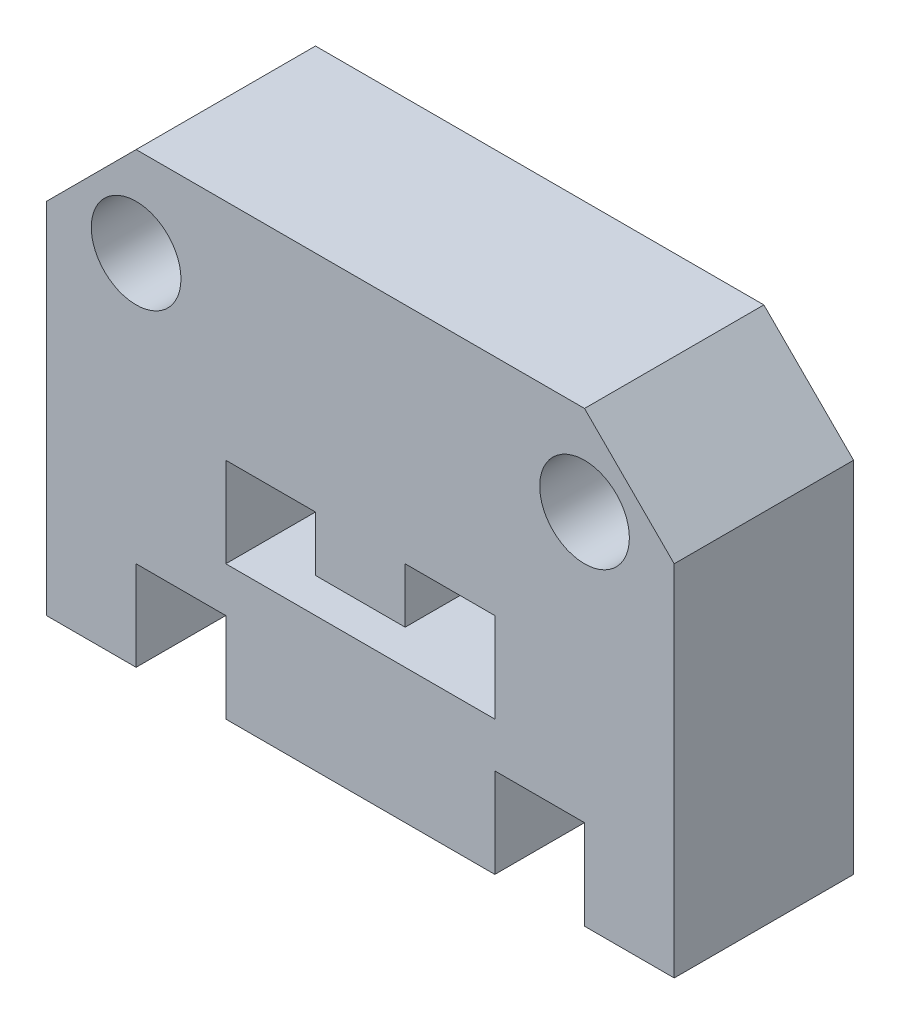
ISO-10303-21;
HEADER;
FILE_DESCRIPTION(('STEP AP214'),'2;1');
FILE_NAME('part.step','',(''),(''),'','','');
FILE_SCHEMA(('AUTOMOTIVE_DESIGN { 1 0 10303 214 1 1 1 1 }'));
ENDSEC;
DATA;
#1=APPLICATION_CONTEXT('core data for automotive mechanical design processes');
#2=APPLICATION_PROTOCOL_DEFINITION('international standard','automotive_design',2000,#1);
#3=PRODUCT_CONTEXT('',#1,'mechanical');
#4=PRODUCT('Part','Part','',(#3));
#5=PRODUCT_RELATED_PRODUCT_CATEGORY('part','',(#4));
#6=PRODUCT_DEFINITION_FORMATION('','',#4);
#7=PRODUCT_DEFINITION_CONTEXT('part definition',#1,'design');
#8=PRODUCT_DEFINITION('design','',#6,#7);
#9=PRODUCT_DEFINITION_SHAPE('','',#8);
#10=(LENGTH_UNIT() NAMED_UNIT(*) SI_UNIT(.MILLI.,.METRE.));
#11=(NAMED_UNIT(*) PLANE_ANGLE_UNIT() SI_UNIT($,.RADIAN.));
#12=(NAMED_UNIT(*) SI_UNIT($,.STERADIAN.) SOLID_ANGLE_UNIT());
#13=UNCERTAINTY_MEASURE_WITH_UNIT(LENGTH_MEASURE(1.E-05),#10,'distance_accuracy_value','');
#14=(GEOMETRIC_REPRESENTATION_CONTEXT(3) GLOBAL_UNCERTAINTY_ASSIGNED_CONTEXT((#13)) GLOBAL_UNIT_ASSIGNED_CONTEXT((#10,
#11,#12)) REPRESENTATION_CONTEXT('',''));
#15=CARTESIAN_POINT('',(0.,0.,0.));
#16=DIRECTION('',(0.,0.,1.));
#17=DIRECTION('',(1.,0.,0.));
#18=AXIS2_PLACEMENT_3D('',#15,#16,#17);
#19=CARTESIAN_POINT('',(0.,0.,20.));
#20=DIRECTION('',(0.,0.,1.));
#21=DIRECTION('',(1.,0.,0.));
#22=AXIS2_PLACEMENT_3D('',#19,#20,#21);
#23=PLANE('',#22);
#24=CARTESIAN_POINT('',(-25.,21.1256147843034,20.));
#25=DIRECTION('',(0.,0.,1.));
#26=DIRECTION('',(1.,0.,0.));
#27=AXIS2_PLACEMENT_3D('',#24,#25,#26);
#28=CIRCLE('',#27,5.);
#29=CARTESIAN_POINT('',(-20.,21.1256147843034,20.));
#30=VERTEX_POINT('',#29);
#31=EDGE_CURVE('E241',#30,#30,#28,.T.);
#32=ORIENTED_EDGE('',*,*,#31,.F.);
#33=EDGE_LOOP('',(#32));
#34=FACE_BOUND('',#33,.T.);
#35=DIRECTION('',(1.,0.,0.));
#36=VECTOR('',#35,1.);
#37=CARTESIAN_POINT('',(-15.,-8.87438521569662,20.));
#38=LINE('',#37,#36);
#39=CARTESIAN_POINT('',(-25.,-8.87438521569663,20.));
#40=VERTEX_POINT('',#39);
#41=CARTESIAN_POINT('',(-15.,-8.87438521569662,20.));
#42=VERTEX_POINT('',#41);
#43=EDGE_CURVE('E285',#40,#42,#38,.T.);
#44=ORIENTED_EDGE('',*,*,#43,.T.);
#45=DIRECTION('',(0.,-1.,0.));
#46=VECTOR('',#45,1.);
#47=CARTESIAN_POINT('',(-15.,-18.8743852156966,20.));
#48=LINE('',#47,#46);
#49=CARTESIAN_POINT('',(-15.,-18.8743852156966,20.));
#50=VERTEX_POINT('',#49);
#51=EDGE_CURVE('E289',#42,#50,#48,.T.);
#52=ORIENTED_EDGE('',*,*,#51,.T.);
#53=DIRECTION('',(1.,0.,0.));
#54=VECTOR('',#53,1.);
#55=CARTESIAN_POINT('',(-15.,-18.8743852156966,20.));
#56=LINE('',#55,#54);
#57=CARTESIAN_POINT('',(15.,-18.8743852156966,20.));
#58=VERTEX_POINT('',#57);
#59=EDGE_CURVE('E293',#50,#58,#56,.T.);
#60=ORIENTED_EDGE('',*,*,#59,.T.);
#61=DIRECTION('',(0.,1.,0.));
#62=VECTOR('',#61,1.);
#63=CARTESIAN_POINT('',(15.,-18.8743852156966,20.));
#64=LINE('',#63,#62);
#65=CARTESIAN_POINT('',(15.,-8.87438521569662,20.));
#66=VERTEX_POINT('',#65);
#67=EDGE_CURVE('E296',#58,#66,#64,.T.);
#68=ORIENTED_EDGE('',*,*,#67,.T.);
#69=DIRECTION('',(1.,0.,0.));
#70=VECTOR('',#69,1.);
#71=CARTESIAN_POINT('',(15.,-8.87438521569662,20.));
#72=LINE('',#71,#70);
#73=CARTESIAN_POINT('',(25.,-8.87438521569662,20.));
#74=VERTEX_POINT('',#73);
#75=EDGE_CURVE('E299',#66,#74,#72,.T.);
#76=ORIENTED_EDGE('',*,*,#75,.T.);
#77=DIRECTION('',(0.,-1.,0.));
#78=VECTOR('',#77,1.);
#79=CARTESIAN_POINT('',(25.,-8.87438521569662,20.));
#80=LINE('',#79,#78);
#81=CARTESIAN_POINT('',(25.,-18.8743852156966,20.));
#82=VERTEX_POINT('',#81);
#83=EDGE_CURVE('E302',#74,#82,#80,.T.);
#84=ORIENTED_EDGE('',*,*,#83,.T.);
#85=DIRECTION('',(1.,0.,0.));
#86=VECTOR('',#85,1.);
#87=CARTESIAN_POINT('',(25.,-18.8743852156966,20.));
#88=LINE('',#87,#86);
#89=CARTESIAN_POINT('',(35.,-18.8743852156966,20.));
#90=VERTEX_POINT('',#89);
#91=EDGE_CURVE('E305',#82,#90,#88,.T.);
#92=ORIENTED_EDGE('',*,*,#91,.T.);
#93=DIRECTION('',(0.,1.,0.));
#94=VECTOR('',#93,1.);
#95=CARTESIAN_POINT('',(35.,-18.8743852156966,20.));
#96=LINE('',#95,#94);
#97=CARTESIAN_POINT('',(35.,21.1256147843034,20.));
#98=VERTEX_POINT('',#97);
#99=EDGE_CURVE('E308',#90,#98,#96,.T.);
#100=ORIENTED_EDGE('',*,*,#99,.T.);
#101=DIRECTION('',(-0.707106781186546,0.707106781186549,0.));
#102=VECTOR('',#101,1.);
#103=CARTESIAN_POINT('',(35.,21.1256147843034,20.));
#104=LINE('',#103,#102);
#105=CARTESIAN_POINT('',(25.,31.1256147843034,20.));
#106=VERTEX_POINT('',#105);
#107=EDGE_CURVE('E311',#98,#106,#104,.T.);
#108=ORIENTED_EDGE('',*,*,#107,.T.);
#109=DIRECTION('',(-1.,0.,0.));
#110=VECTOR('',#109,1.);
#111=CARTESIAN_POINT('',(-25.,31.1256147843034,20.));
#112=LINE('',#111,#110);
#113=CARTESIAN_POINT('',(-25.,31.1256147843034,20.));
#114=VERTEX_POINT('',#113);
#115=EDGE_CURVE('E314',#106,#114,#112,.T.);
#116=ORIENTED_EDGE('',*,*,#115,.T.);
#117=DIRECTION('',(-0.707106781186547,-0.707106781186548,0.));
#118=VECTOR('',#117,1.);
#119=CARTESIAN_POINT('',(-35.,21.1256147843034,20.));
#120=LINE('',#119,#118);
#121=CARTESIAN_POINT('',(-35.,21.1256147843034,20.));
#122=VERTEX_POINT('',#121);
#123=EDGE_CURVE('E317',#114,#122,#120,.T.);
#124=ORIENTED_EDGE('',*,*,#123,.T.);
#125=DIRECTION('',(0.,-1.,0.));
#126=VECTOR('',#125,1.);
#127=CARTESIAN_POINT('',(-35.,-18.8743852156966,20.));
#128=LINE('',#127,#126);
#129=CARTESIAN_POINT('',(-35.,-18.8743852156966,20.));
#130=VERTEX_POINT('',#129);
#131=EDGE_CURVE('E320',#122,#130,#128,.T.);
#132=ORIENTED_EDGE('',*,*,#131,.T.);
#133=DIRECTION('',(1.,0.,0.));
#134=VECTOR('',#133,1.);
#135=CARTESIAN_POINT('',(-25.,-18.8743852156966,20.));
#136=LINE('',#135,#134);
#137=CARTESIAN_POINT('',(-25.,-18.8743852156966,20.));
#138=VERTEX_POINT('',#137);
#139=EDGE_CURVE('E323',#130,#138,#136,.T.);
#140=ORIENTED_EDGE('',*,*,#139,.T.);
#141=DIRECTION('',(0.,1.,0.));
#142=VECTOR('',#141,1.);
#143=CARTESIAN_POINT('',(-25.,-8.87438521569663,20.));
#144=LINE('',#143,#142);
#145=EDGE_CURVE('E326',#138,#40,#144,.T.);
#146=ORIENTED_EDGE('',*,*,#145,.T.);
#147=EDGE_LOOP('',(#44,#52,#60,#68,#76,#84,#92,#100,#108,#116,#124,#132,#140,#146));
#148=FACE_BOUND('',#147,.T.);
#149=DIRECTION('',(-1.,0.,0.));
#150=VECTOR('',#149,1.);
#151=CARTESIAN_POINT('',(-5.,0.,20.));
#152=LINE('',#151,#150);
#153=CARTESIAN_POINT('',(5.,0.,20.));
#154=VERTEX_POINT('',#153);
#155=CARTESIAN_POINT('',(-5.,0.,20.));
#156=VERTEX_POINT('',#155);
#157=EDGE_CURVE('E202',#154,#156,#152,.T.);
#158=ORIENTED_EDGE('',*,*,#157,.F.);
#159=DIRECTION('',(0.,-1.,0.));
#160=VECTOR('',#159,1.);
#161=CARTESIAN_POINT('',(5.,6.12561478430338,20.));
#162=LINE('',#161,#160);
#163=CARTESIAN_POINT('',(5.,6.12561478430338,20.));
#164=VERTEX_POINT('',#163);
#165=EDGE_CURVE('E193',#164,#154,#162,.T.);
#166=ORIENTED_EDGE('',*,*,#165,.F.);
#167=DIRECTION('',(-1.,0.,0.));
#168=VECTOR('',#167,1.);
#169=CARTESIAN_POINT('',(15.,6.12561478430338,20.));
#170=LINE('',#169,#168);
#171=CARTESIAN_POINT('',(15.,6.12561478430338,20.));
#172=VERTEX_POINT('',#171);
#173=EDGE_CURVE('E236',#172,#164,#170,.T.);
#174=ORIENTED_EDGE('',*,*,#173,.F.);
#175=DIRECTION('',(0.,1.,0.));
#176=VECTOR('',#175,1.);
#177=CARTESIAN_POINT('',(15.,-3.87438521569662,20.));
#178=LINE('',#177,#176);
#179=CARTESIAN_POINT('',(15.,-3.87438521569662,20.));
#180=VERTEX_POINT('',#179);
#181=EDGE_CURVE('E233',#180,#172,#178,.T.);
#182=ORIENTED_EDGE('',*,*,#181,.F.);
#183=DIRECTION('',(1.,0.,0.));
#184=VECTOR('',#183,1.);
#185=CARTESIAN_POINT('',(-15.,-3.87438521569662,20.));
#186=LINE('',#185,#184);
#187=CARTESIAN_POINT('',(-15.,-3.87438521569662,20.));
#188=VERTEX_POINT('',#187);
#189=EDGE_CURVE('E230',#188,#180,#186,.T.);
#190=ORIENTED_EDGE('',*,*,#189,.F.);
#191=DIRECTION('',(0.,-1.,0.));
#192=VECTOR('',#191,1.);
#193=CARTESIAN_POINT('',(-15.,-3.87438521569662,20.));
#194=LINE('',#193,#192);
#195=CARTESIAN_POINT('',(-15.,6.12561478430338,20.));
#196=VERTEX_POINT('',#195);
#197=EDGE_CURVE('E227',#196,#188,#194,.T.);
#198=ORIENTED_EDGE('',*,*,#197,.F.);
#199=DIRECTION('',(-1.,0.,0.));
#200=VECTOR('',#199,1.);
#201=CARTESIAN_POINT('',(-15.,6.12561478430338,20.));
#202=LINE('',#201,#200);
#203=CARTESIAN_POINT('',(-5.,6.12561478430338,20.));
#204=VERTEX_POINT('',#203);
#205=EDGE_CURVE('E221',#204,#196,#202,.T.);
#206=ORIENTED_EDGE('',*,*,#205,.F.);
#207=DIRECTION('',(0.,1.,0.));
#208=VECTOR('',#207,1.);
#209=CARTESIAN_POINT('',(-5.,6.12561478430338,20.));
#210=LINE('',#209,#208);
#211=EDGE_CURVE('E217',#156,#204,#210,.T.);
#212=ORIENTED_EDGE('',*,*,#211,.F.);
#213=EDGE_LOOP('',(#158,#166,#174,#182,#190,#198,#206,#212));
#214=FACE_BOUND('',#213,.T.);
#215=CARTESIAN_POINT('',(25.,21.1256147843034,20.));
#216=DIRECTION('',(0.,0.,1.));
#217=DIRECTION('',(1.,0.,0.));
#218=AXIS2_PLACEMENT_3D('',#215,#216,#217);
#219=CIRCLE('',#218,5.);
#220=CARTESIAN_POINT('',(30.,21.1256147843034,20.));
#221=VERTEX_POINT('',#220);
#222=EDGE_CURVE('E768',#221,#221,#219,.T.);
#223=ORIENTED_EDGE('',*,*,#222,.F.);
#224=EDGE_LOOP('',(#223));
#225=FACE_BOUND('',#224,.T.);
#226=ADVANCED_FACE('F43',(#34,#148,#214,#225),#23,.T.);
#227=CARTESIAN_POINT('',(0.,0.,0.));
#228=DIRECTION('',(0.,0.,1.));
#229=DIRECTION('',(1.,0.,0.));
#230=AXIS2_PLACEMENT_3D('',#227,#228,#229);
#231=PLANE('',#230);
#232=DIRECTION('',(1.,0.,0.));
#233=VECTOR('',#232,1.);
#234=CARTESIAN_POINT('',(-15.,-8.87438521569662,0.));
#235=LINE('',#234,#233);
#236=CARTESIAN_POINT('',(-25.,-8.87438521569663,0.));
#237=VERTEX_POINT('',#236);
#238=CARTESIAN_POINT('',(-15.,-8.87438521569662,0.));
#239=VERTEX_POINT('',#238);
#240=EDGE_CURVE('E211',#237,#239,#235,.T.);
#241=ORIENTED_EDGE('',*,*,#240,.F.);
#242=DIRECTION('',(0.,1.,0.));
#243=VECTOR('',#242,1.);
#244=CARTESIAN_POINT('',(-25.,-8.87438521569663,0.));
#245=LINE('',#244,#243);
#246=CARTESIAN_POINT('',(-25.,-18.8743852156966,0.));
#247=VERTEX_POINT('',#246);
#248=EDGE_CURVE('E290',#247,#237,#245,.T.);
#249=ORIENTED_EDGE('',*,*,#248,.F.);
#250=DIRECTION('',(1.,0.,0.));
#251=VECTOR('',#250,1.);
#252=CARTESIAN_POINT('',(-25.,-18.8743852156966,0.));
#253=LINE('',#252,#251);
#254=CARTESIAN_POINT('',(-35.,-18.8743852156966,0.));
#255=VERTEX_POINT('',#254);
#256=EDGE_CURVE('E366',#255,#247,#253,.T.);
#257=ORIENTED_EDGE('',*,*,#256,.F.);
#258=DIRECTION('',(0.,-1.,0.));
#259=VECTOR('',#258,1.);
#260=CARTESIAN_POINT('',(-35.,-18.8743852156966,0.));
#261=LINE('',#260,#259);
#262=CARTESIAN_POINT('',(-35.,21.1256147843034,0.));
#263=VERTEX_POINT('',#262);
#264=EDGE_CURVE('E363',#263,#255,#261,.T.);
#265=ORIENTED_EDGE('',*,*,#264,.F.);
#266=DIRECTION('',(-0.707106781186547,-0.707106781186548,0.));
#267=VECTOR('',#266,1.);
#268=CARTESIAN_POINT('',(-35.,21.1256147843034,0.));
#269=LINE('',#268,#267);
#270=CARTESIAN_POINT('',(-25.,31.1256147843034,0.));
#271=VERTEX_POINT('',#270);
#272=EDGE_CURVE('E360',#271,#263,#269,.T.);
#273=ORIENTED_EDGE('',*,*,#272,.F.);
#274=DIRECTION('',(-1.,0.,0.));
#275=VECTOR('',#274,1.);
#276=CARTESIAN_POINT('',(-25.,31.1256147843034,0.));
#277=LINE('',#276,#275);
#278=CARTESIAN_POINT('',(25.,31.1256147843034,0.));
#279=VERTEX_POINT('',#278);
#280=EDGE_CURVE('E357',#279,#271,#277,.T.);
#281=ORIENTED_EDGE('',*,*,#280,.F.);
#282=DIRECTION('',(-0.707106781186546,0.707106781186549,0.));
#283=VECTOR('',#282,1.);
#284=CARTESIAN_POINT('',(35.,21.1256147843034,0.));
#285=LINE('',#284,#283);
#286=CARTESIAN_POINT('',(35.,21.1256147843034,0.));
#287=VERTEX_POINT('',#286);
#288=EDGE_CURVE('E354',#287,#279,#285,.T.);
#289=ORIENTED_EDGE('',*,*,#288,.F.);
#290=DIRECTION('',(0.,1.,0.));
#291=VECTOR('',#290,1.);
#292=CARTESIAN_POINT('',(35.,-18.8743852156966,0.));
#293=LINE('',#292,#291);
#294=CARTESIAN_POINT('',(35.,-18.8743852156966,0.));
#295=VERTEX_POINT('',#294);
#296=EDGE_CURVE('E351',#295,#287,#293,.T.);
#297=ORIENTED_EDGE('',*,*,#296,.F.);
#298=DIRECTION('',(1.,0.,0.));
#299=VECTOR('',#298,1.);
#300=CARTESIAN_POINT('',(25.,-18.8743852156966,0.));
#301=LINE('',#300,#299);
#302=CARTESIAN_POINT('',(25.,-18.8743852156966,0.));
#303=VERTEX_POINT('',#302);
#304=EDGE_CURVE('E348',#303,#295,#301,.T.);
#305=ORIENTED_EDGE('',*,*,#304,.F.);
#306=DIRECTION('',(0.,-1.,0.));
#307=VECTOR('',#306,1.);
#308=CARTESIAN_POINT('',(25.,-8.87438521569662,0.));
#309=LINE('',#308,#307);
#310=CARTESIAN_POINT('',(25.,-8.87438521569662,0.));
#311=VERTEX_POINT('',#310);
#312=EDGE_CURVE('E345',#311,#303,#309,.T.);
#313=ORIENTED_EDGE('',*,*,#312,.F.);
#314=DIRECTION('',(1.,0.,0.));
#315=VECTOR('',#314,1.);
#316=CARTESIAN_POINT('',(15.,-8.87438521569662,0.));
#317=LINE('',#316,#315);
#318=CARTESIAN_POINT('',(15.,-8.87438521569662,0.));
#319=VERTEX_POINT('',#318);
#320=EDGE_CURVE('E342',#319,#311,#317,.T.);
#321=ORIENTED_EDGE('',*,*,#320,.F.);
#322=DIRECTION('',(0.,1.,0.));
#323=VECTOR('',#322,1.);
#324=CARTESIAN_POINT('',(15.,-18.8743852156966,0.));
#325=LINE('',#324,#323);
#326=CARTESIAN_POINT('',(15.,-18.8743852156966,0.));
#327=VERTEX_POINT('',#326);
#328=EDGE_CURVE('E339',#327,#319,#325,.T.);
#329=ORIENTED_EDGE('',*,*,#328,.F.);
#330=DIRECTION('',(1.,0.,0.));
#331=VECTOR('',#330,1.);
#332=CARTESIAN_POINT('',(-15.,-18.8743852156966,0.));
#333=LINE('',#332,#331);
#334=CARTESIAN_POINT('',(-15.,-18.8743852156966,0.));
#335=VERTEX_POINT('',#334);
#336=EDGE_CURVE('E336',#335,#327,#333,.T.);
#337=ORIENTED_EDGE('',*,*,#336,.F.);
#338=DIRECTION('',(0.,-1.,0.));
#339=VECTOR('',#338,1.);
#340=CARTESIAN_POINT('',(-15.,-18.8743852156966,0.));
#341=LINE('',#340,#339);
#342=EDGE_CURVE('E333',#239,#335,#341,.T.);
#343=ORIENTED_EDGE('',*,*,#342,.F.);
#344=EDGE_LOOP('',(#241,#249,#257,#265,#273,#281,#289,#297,#305,#313,#321,#329,#337,#343));
#345=FACE_BOUND('',#344,.T.);
#346=DIRECTION('',(0.,-1.,0.));
#347=VECTOR('',#346,1.);
#348=CARTESIAN_POINT('',(5.,6.12561478430338,0.));
#349=LINE('',#348,#347);
#350=CARTESIAN_POINT('',(5.,6.12561478430338,0.));
#351=VERTEX_POINT('',#350);
#352=CARTESIAN_POINT('',(5.,0.,0.));
#353=VERTEX_POINT('',#352);
#354=EDGE_CURVE('E67',#351,#353,#349,.T.);
#355=ORIENTED_EDGE('',*,*,#354,.T.);
#356=DIRECTION('',(-1.,0.,0.));
#357=VECTOR('',#356,1.);
#358=CARTESIAN_POINT('',(-5.,0.,0.));
#359=LINE('',#358,#357);
#360=CARTESIAN_POINT('',(-5.,0.,0.));
#361=VERTEX_POINT('',#360);
#362=EDGE_CURVE('E209',#353,#361,#359,.T.);
#363=ORIENTED_EDGE('',*,*,#362,.T.);
#364=DIRECTION('',(0.,1.,0.));
#365=VECTOR('',#364,1.);
#366=CARTESIAN_POINT('',(-5.,6.12561478430338,0.));
#367=LINE('',#366,#365);
#368=CARTESIAN_POINT('',(-5.,6.12561478430338,0.));
#369=VERTEX_POINT('',#368);
#370=EDGE_CURVE('E244',#361,#369,#367,.T.);
#371=ORIENTED_EDGE('',*,*,#370,.T.);
#372=DIRECTION('',(-1.,0.,0.));
#373=VECTOR('',#372,1.);
#374=CARTESIAN_POINT('',(-15.,6.12561478430338,0.));
#375=LINE('',#374,#373);
#376=CARTESIAN_POINT('',(-15.,6.12561478430338,0.));
#377=VERTEX_POINT('',#376);
#378=EDGE_CURVE('E248',#369,#377,#375,.T.);
#379=ORIENTED_EDGE('',*,*,#378,.T.);
#380=DIRECTION('',(0.,-1.,0.));
#381=VECTOR('',#380,1.);
#382=CARTESIAN_POINT('',(-15.,-3.87438521569662,0.));
#383=LINE('',#382,#381);
#384=CARTESIAN_POINT('',(-15.,-3.87438521569662,0.));
#385=VERTEX_POINT('',#384);
#386=EDGE_CURVE('E252',#377,#385,#383,.T.);
#387=ORIENTED_EDGE('',*,*,#386,.T.);
#388=DIRECTION('',(1.,0.,0.));
#389=VECTOR('',#388,1.);
#390=CARTESIAN_POINT('',(-15.,-3.87438521569662,0.));
#391=LINE('',#390,#389);
#392=CARTESIAN_POINT('',(15.,-3.87438521569662,0.));
#393=VERTEX_POINT('',#392);
#394=EDGE_CURVE('E256',#385,#393,#391,.T.);
#395=ORIENTED_EDGE('',*,*,#394,.T.);
#396=DIRECTION('',(0.,1.,0.));
#397=VECTOR('',#396,1.);
#398=CARTESIAN_POINT('',(15.,-3.87438521569662,0.));
#399=LINE('',#398,#397);
#400=CARTESIAN_POINT('',(15.,6.12561478430338,0.));
#401=VERTEX_POINT('',#400);
#402=EDGE_CURVE('E260',#393,#401,#399,.T.);
#403=ORIENTED_EDGE('',*,*,#402,.T.);
#404=DIRECTION('',(-1.,0.,0.));
#405=VECTOR('',#404,1.);
#406=CARTESIAN_POINT('',(15.,6.12561478430338,0.));
#407=LINE('',#406,#405);
#408=EDGE_CURVE('E203',#401,#351,#407,.T.);
#409=ORIENTED_EDGE('',*,*,#408,.T.);
#410=EDGE_LOOP('',(#355,#363,#371,#379,#387,#395,#403,#409));
#411=FACE_BOUND('',#410,.T.);
#412=CARTESIAN_POINT('',(-25.,21.1256147843034,0.));
#413=DIRECTION('',(0.,0.,1.));
#414=DIRECTION('',(1.,0.,0.));
#415=AXIS2_PLACEMENT_3D('',#412,#413,#414);
#416=CIRCLE('',#415,5.);
#417=CARTESIAN_POINT('',(-20.,21.1256147843034,0.));
#418=VERTEX_POINT('',#417);
#419=EDGE_CURVE('E776',#418,#418,#416,.T.);
#420=ORIENTED_EDGE('',*,*,#419,.T.);
#421=EDGE_LOOP('',(#420));
#422=FACE_BOUND('',#421,.T.);
#423=CARTESIAN_POINT('',(25.,21.1256147843034,0.));
#424=DIRECTION('',(0.,0.,1.));
#425=DIRECTION('',(1.,0.,0.));
#426=AXIS2_PLACEMENT_3D('',#423,#424,#425);
#427=CIRCLE('',#426,5.);
#428=CARTESIAN_POINT('',(30.,21.1256147843034,0.));
#429=VERTEX_POINT('',#428);
#430=EDGE_CURVE('E771',#429,#429,#427,.T.);
#431=ORIENTED_EDGE('',*,*,#430,.T.);
#432=EDGE_LOOP('',(#431));
#433=FACE_BOUND('',#432,.T.);
#434=ADVANCED_FACE('F429',(#345,#411,#422,#433),#231,.F.);
#435=CARTESIAN_POINT('',(-15.,-8.87438521569662,20.));
#436=DIRECTION('',(0.,1.,0.));
#437=DIRECTION('',(-1.,0.,0.));
#438=AXIS2_PLACEMENT_3D('',#435,#436,#437);
#439=PLANE('',#438);
#440=ORIENTED_EDGE('',*,*,#240,.T.);
#441=DIRECTION('',(0.,0.,-1.));
#442=VECTOR('',#441,1.);
#443=CARTESIAN_POINT('',(-15.,-8.87438521569662,20.));
#444=LINE('',#443,#442);
#445=EDGE_CURVE('E11',#42,#239,#444,.T.);
#446=ORIENTED_EDGE('',*,*,#445,.F.);
#447=ORIENTED_EDGE('',*,*,#43,.F.);
#448=DIRECTION('',(0.,0.,-1.));
#449=VECTOR('',#448,1.);
#450=CARTESIAN_POINT('',(-25.,-8.87438521569663,20.));
#451=LINE('',#450,#449);
#452=EDGE_CURVE('E329',#40,#237,#451,.T.);
#453=ORIENTED_EDGE('',*,*,#452,.T.);
#454=EDGE_LOOP('',(#440,#446,#447,#453));
#455=FACE_BOUND('',#454,.T.);
#456=ADVANCED_FACE('F45',(#455),#439,.F.);
#457=CARTESIAN_POINT('',(-15.,-18.8743852156966,20.));
#458=DIRECTION('',(1.,0.,0.));
#459=DIRECTION('',(0.,0.,-1.));
#460=AXIS2_PLACEMENT_3D('',#457,#458,#459);
#461=PLANE('',#460);
#462=ORIENTED_EDGE('',*,*,#342,.T.);
#463=DIRECTION('',(0.,0.,-1.));
#464=VECTOR('',#463,1.);
#465=CARTESIAN_POINT('',(-15.,-18.8743852156966,20.));
#466=LINE('',#465,#464);
#467=EDGE_CURVE('E52',#50,#335,#466,.T.);
#468=ORIENTED_EDGE('',*,*,#467,.F.);
#469=ORIENTED_EDGE('',*,*,#51,.F.);
#470=ORIENTED_EDGE('',*,*,#445,.T.);
#471=EDGE_LOOP('',(#462,#468,#469,#470));
#472=FACE_BOUND('',#471,.T.);
#473=ADVANCED_FACE('F446',(#472),#461,.F.);
#474=CARTESIAN_POINT('',(-15.,-18.8743852156966,20.));
#475=DIRECTION('',(0.,1.,0.));
#476=DIRECTION('',(0.,0.,1.));
#477=AXIS2_PLACEMENT_3D('',#474,#475,#476);
#478=PLANE('',#477);
#479=ORIENTED_EDGE('',*,*,#336,.T.);
#480=DIRECTION('',(0.,0.,-1.));
#481=VECTOR('',#480,1.);
#482=CARTESIAN_POINT('',(15.,-18.8743852156966,20.));
#483=LINE('',#482,#481);
#484=EDGE_CURVE('E414',#58,#327,#483,.T.);
#485=ORIENTED_EDGE('',*,*,#484,.F.);
#486=ORIENTED_EDGE('',*,*,#59,.F.);
#487=ORIENTED_EDGE('',*,*,#467,.T.);
#488=EDGE_LOOP('',(#479,#485,#486,#487));
#489=FACE_BOUND('',#488,.T.);
#490=ADVANCED_FACE('F423',(#489),#478,.F.);
#491=CARTESIAN_POINT('',(15.,-18.8743852156966,20.));
#492=DIRECTION('',(-1.,0.,0.));
#493=DIRECTION('',(0.,-1.,0.));
#494=AXIS2_PLACEMENT_3D('',#491,#492,#493);
#495=PLANE('',#494);
#496=ORIENTED_EDGE('',*,*,#328,.T.);
#497=DIRECTION('',(0.,0.,-1.));
#498=VECTOR('',#497,1.);
#499=CARTESIAN_POINT('',(15.,-8.87438521569662,20.));
#500=LINE('',#499,#498);
#501=EDGE_CURVE('E410',#66,#319,#500,.T.);
#502=ORIENTED_EDGE('',*,*,#501,.F.);
#503=ORIENTED_EDGE('',*,*,#67,.F.);
#504=ORIENTED_EDGE('',*,*,#484,.T.);
#505=EDGE_LOOP('',(#496,#502,#503,#504));
#506=FACE_BOUND('',#505,.T.);
#507=ADVANCED_FACE('F435',(#506),#495,.F.);
#508=CARTESIAN_POINT('',(15.,-8.87438521569662,20.));
#509=DIRECTION('',(0.,1.,0.));
#510=DIRECTION('',(0.,0.,1.));
#511=AXIS2_PLACEMENT_3D('',#508,#509,#510);
#512=PLANE('',#511);
#513=ORIENTED_EDGE('',*,*,#320,.T.);
#514=DIRECTION('',(0.,0.,-1.));
#515=VECTOR('',#514,1.);
#516=CARTESIAN_POINT('',(25.,-8.87438521569662,20.));
#517=LINE('',#516,#515);
#518=EDGE_CURVE('E406',#74,#311,#517,.T.);
#519=ORIENTED_EDGE('',*,*,#518,.F.);
#520=ORIENTED_EDGE('',*,*,#75,.F.);
#521=ORIENTED_EDGE('',*,*,#501,.T.);
#522=EDGE_LOOP('',(#513,#519,#520,#521));
#523=FACE_BOUND('',#522,.T.);
#524=ADVANCED_FACE('F439',(#523),#512,.F.);
#525=CARTESIAN_POINT('',(25.,-8.87438521569662,20.));
#526=DIRECTION('',(1.,0.,0.));
#527=DIRECTION('',(0.,1.,0.));
#528=AXIS2_PLACEMENT_3D('',#525,#526,#527);
#529=PLANE('',#528);
#530=ORIENTED_EDGE('',*,*,#312,.T.);
#531=DIRECTION('',(0.,0.,-1.));
#532=VECTOR('',#531,1.);
#533=CARTESIAN_POINT('',(25.,-18.8743852156966,20.));
#534=LINE('',#533,#532);
#535=EDGE_CURVE('E402',#82,#303,#534,.T.);
#536=ORIENTED_EDGE('',*,*,#535,.F.);
#537=ORIENTED_EDGE('',*,*,#83,.F.);
#538=ORIENTED_EDGE('',*,*,#518,.T.);
#539=EDGE_LOOP('',(#530,#536,#537,#538));
#540=FACE_BOUND('',#539,.T.);
#541=ADVANCED_FACE('F489',(#540),#529,.F.);
#542=CARTESIAN_POINT('',(25.,-18.8743852156966,20.));
#543=DIRECTION('',(0.,1.,0.));
#544=DIRECTION('',(0.,0.,1.));
#545=AXIS2_PLACEMENT_3D('',#542,#543,#544);
#546=PLANE('',#545);
#547=ORIENTED_EDGE('',*,*,#304,.T.);
#548=DIRECTION('',(0.,0.,-1.));
#549=VECTOR('',#548,1.);
#550=CARTESIAN_POINT('',(35.,-18.8743852156966,20.));
#551=LINE('',#550,#549);
#552=EDGE_CURVE('E398',#90,#295,#551,.T.);
#553=ORIENTED_EDGE('',*,*,#552,.F.);
#554=ORIENTED_EDGE('',*,*,#91,.F.);
#555=ORIENTED_EDGE('',*,*,#535,.T.);
#556=EDGE_LOOP('',(#547,#553,#554,#555));
#557=FACE_BOUND('',#556,.T.);
#558=ADVANCED_FACE('F487',(#557),#546,.F.);
#559=CARTESIAN_POINT('',(35.,-18.8743852156966,20.));
#560=DIRECTION('',(-1.,0.,0.));
#561=DIRECTION('',(0.,-1.,0.));
#562=AXIS2_PLACEMENT_3D('',#559,#560,#561);
#563=PLANE('',#562);
#564=ORIENTED_EDGE('',*,*,#296,.T.);
#565=DIRECTION('',(0.,0.,-1.));
#566=VECTOR('',#565,1.);
#567=CARTESIAN_POINT('',(35.,21.1256147843034,20.));
#568=LINE('',#567,#566);
#569=EDGE_CURVE('E394',#98,#287,#568,.T.);
#570=ORIENTED_EDGE('',*,*,#569,.F.);
#571=ORIENTED_EDGE('',*,*,#99,.F.);
#572=ORIENTED_EDGE('',*,*,#552,.T.);
#573=EDGE_LOOP('',(#564,#570,#571,#572));
#574=FACE_BOUND('',#573,.T.);
#575=ADVANCED_FACE('F482',(#574),#563,.F.);
#576=CARTESIAN_POINT('',(35.,21.1256147843034,20.));
#577=DIRECTION('',(-0.707106781186549,-0.707106781186546,0.));
#578=DIRECTION('',(0.707106781186546,-0.707106781186549,0.));
#579=AXIS2_PLACEMENT_3D('',#576,#577,#578);
#580=PLANE('',#579);
#581=ORIENTED_EDGE('',*,*,#288,.T.);
#582=DIRECTION('',(0.,0.,-1.));
#583=VECTOR('',#582,1.);
#584=CARTESIAN_POINT('',(25.,31.1256147843034,20.));
#585=LINE('',#584,#583);
#586=EDGE_CURVE('E390',#106,#279,#585,.T.);
#587=ORIENTED_EDGE('',*,*,#586,.F.);
#588=ORIENTED_EDGE('',*,*,#107,.F.);
#589=ORIENTED_EDGE('',*,*,#569,.T.);
#590=EDGE_LOOP('',(#581,#587,#588,#589));
#591=FACE_BOUND('',#590,.T.);
#592=ADVANCED_FACE('F477',(#591),#580,.F.);
#593=CARTESIAN_POINT('',(-25.,31.1256147843034,20.));
#594=DIRECTION('',(0.,-1.,0.));
#595=DIRECTION('',(0.,0.,-1.));
#596=AXIS2_PLACEMENT_3D('',#593,#594,#595);
#597=PLANE('',#596);
#598=ORIENTED_EDGE('',*,*,#280,.T.);
#599=DIRECTION('',(0.,0.,-1.));
#600=VECTOR('',#599,1.);
#601=CARTESIAN_POINT('',(-25.,31.1256147843034,20.));
#602=LINE('',#601,#600);
#603=EDGE_CURVE('E386',#114,#271,#602,.T.);
#604=ORIENTED_EDGE('',*,*,#603,.F.);
#605=ORIENTED_EDGE('',*,*,#115,.F.);
#606=ORIENTED_EDGE('',*,*,#586,.T.);
#607=EDGE_LOOP('',(#598,#604,#605,#606));
#608=FACE_BOUND('',#607,.T.);
#609=ADVANCED_FACE('F473',(#608),#597,.F.);
#610=CARTESIAN_POINT('',(-35.,21.1256147843034,20.));
#611=DIRECTION('',(0.707106781186548,-0.707106781186547,0.));
#612=DIRECTION('',(0.707106781186547,0.707106781186548,0.));
#613=AXIS2_PLACEMENT_3D('',#610,#611,#612);
#614=PLANE('',#613);
#615=ORIENTED_EDGE('',*,*,#272,.T.);
#616=DIRECTION('',(0.,0.,-1.));
#617=VECTOR('',#616,1.);
#618=CARTESIAN_POINT('',(-35.,21.1256147843034,20.));
#619=LINE('',#618,#617);
#620=EDGE_CURVE('E382',#122,#263,#619,.T.);
#621=ORIENTED_EDGE('',*,*,#620,.F.);
#622=ORIENTED_EDGE('',*,*,#123,.F.);
#623=ORIENTED_EDGE('',*,*,#603,.T.);
#624=EDGE_LOOP('',(#615,#621,#622,#623));
#625=FACE_BOUND('',#624,.T.);
#626=ADVANCED_FACE('F468',(#625),#614,.F.);
#627=CARTESIAN_POINT('',(-35.,-18.8743852156966,20.));
#628=DIRECTION('',(1.,0.,0.));
#629=DIRECTION('',(0.,1.,0.));
#630=AXIS2_PLACEMENT_3D('',#627,#628,#629);
#631=PLANE('',#630);
#632=ORIENTED_EDGE('',*,*,#264,.T.);
#633=DIRECTION('',(0.,0.,-1.));
#634=VECTOR('',#633,1.);
#635=CARTESIAN_POINT('',(-35.,-18.8743852156966,20.));
#636=LINE('',#635,#634);
#637=EDGE_CURVE('E378',#130,#255,#636,.T.);
#638=ORIENTED_EDGE('',*,*,#637,.F.);
#639=ORIENTED_EDGE('',*,*,#131,.F.);
#640=ORIENTED_EDGE('',*,*,#620,.T.);
#641=EDGE_LOOP('',(#632,#638,#639,#640));
#642=FACE_BOUND('',#641,.T.);
#643=ADVANCED_FACE('F462',(#642),#631,.F.);
#644=CARTESIAN_POINT('',(-25.,-18.8743852156966,20.));
#645=DIRECTION('',(0.,1.,0.));
#646=DIRECTION('',(0.,0.,1.));
#647=AXIS2_PLACEMENT_3D('',#644,#645,#646);
#648=PLANE('',#647);
#649=ORIENTED_EDGE('',*,*,#256,.T.);
#650=DIRECTION('',(0.,0.,-1.));
#651=VECTOR('',#650,1.);
#652=CARTESIAN_POINT('',(-25.,-18.8743852156966,20.));
#653=LINE('',#652,#651);
#654=EDGE_CURVE('E374',#138,#247,#653,.T.);
#655=ORIENTED_EDGE('',*,*,#654,.F.);
#656=ORIENTED_EDGE('',*,*,#139,.F.);
#657=ORIENTED_EDGE('',*,*,#637,.T.);
#658=EDGE_LOOP('',(#649,#655,#656,#657));
#659=FACE_BOUND('',#658,.T.);
#660=ADVANCED_FACE('F458',(#659),#648,.F.);
#661=CARTESIAN_POINT('',(-25.,-8.87438521569663,20.));
#662=DIRECTION('',(-1.,0.,0.));
#663=DIRECTION('',(0.,0.,1.));
#664=AXIS2_PLACEMENT_3D('',#661,#662,#663);
#665=PLANE('',#664);
#666=ORIENTED_EDGE('',*,*,#248,.T.);
#667=ORIENTED_EDGE('',*,*,#452,.F.);
#668=ORIENTED_EDGE('',*,*,#145,.F.);
#669=ORIENTED_EDGE('',*,*,#654,.T.);
#670=EDGE_LOOP('',(#666,#667,#668,#669));
#671=FACE_BOUND('',#670,.T.);
#672=ADVANCED_FACE('F453',(#671),#665,.F.);
#673=CARTESIAN_POINT('',(5.,6.12561478430338,20.));
#674=DIRECTION('',(1.,0.,0.));
#675=DIRECTION('',(0.,1.,0.));
#676=AXIS2_PLACEMENT_3D('',#673,#674,#675);
#677=PLANE('',#676);
#678=ORIENTED_EDGE('',*,*,#354,.F.);
#679=DIRECTION('',(0.,0.,-1.));
#680=VECTOR('',#679,1.);
#681=CARTESIAN_POINT('',(5.,6.12561478430338,20.));
#682=LINE('',#681,#680);
#683=EDGE_CURVE('E197',#164,#351,#682,.T.);
#684=ORIENTED_EDGE('',*,*,#683,.F.);
#685=ORIENTED_EDGE('',*,*,#165,.T.);
#686=DIRECTION('',(0.,0.,-1.));
#687=VECTOR('',#686,1.);
#688=CARTESIAN_POINT('',(5.,0.,20.));
#689=LINE('',#688,#687);
#690=EDGE_CURVE('E196',#154,#353,#689,.T.);
#691=ORIENTED_EDGE('',*,*,#690,.T.);
#692=EDGE_LOOP('',(#678,#684,#685,#691));
#693=FACE_BOUND('',#692,.T.);
#694=ADVANCED_FACE('F195',(#693),#677,.T.);
#695=CARTESIAN_POINT('',(-5.,0.,20.));
#696=DIRECTION('',(0.,-1.,0.));
#697=DIRECTION('',(1.,0.,0.));
#698=AXIS2_PLACEMENT_3D('',#695,#696,#697);
#699=PLANE('',#698);
#700=ORIENTED_EDGE('',*,*,#362,.F.);
#701=ORIENTED_EDGE('',*,*,#690,.F.);
#702=ORIENTED_EDGE('',*,*,#157,.T.);
#703=DIRECTION('',(0.,0.,-1.));
#704=VECTOR('',#703,1.);
#705=CARTESIAN_POINT('',(-5.,0.,20.));
#706=LINE('',#705,#704);
#707=EDGE_CURVE('E212',#156,#361,#706,.T.);
#708=ORIENTED_EDGE('',*,*,#707,.T.);
#709=EDGE_LOOP('',(#700,#701,#702,#708));
#710=FACE_BOUND('',#709,.T.);
#711=ADVANCED_FACE('F206',(#710),#699,.T.);
#712=CARTESIAN_POINT('',(-5.,6.12561478430338,20.));
#713=DIRECTION('',(-1.,0.,0.));
#714=DIRECTION('',(0.,0.,1.));
#715=AXIS2_PLACEMENT_3D('',#712,#713,#714);
#716=PLANE('',#715);
#717=ORIENTED_EDGE('',*,*,#370,.F.);
#718=ORIENTED_EDGE('',*,*,#707,.F.);
#719=ORIENTED_EDGE('',*,*,#211,.T.);
#720=DIRECTION('',(0.,0.,-1.));
#721=VECTOR('',#720,1.);
#722=CARTESIAN_POINT('',(-5.,6.12561478430338,20.));
#723=LINE('',#722,#721);
#724=EDGE_CURVE('E280',#204,#369,#723,.T.);
#725=ORIENTED_EDGE('',*,*,#724,.T.);
#726=EDGE_LOOP('',(#717,#718,#719,#725));
#727=FACE_BOUND('',#726,.T.);
#728=ADVANCED_FACE('F561',(#727),#716,.T.);
#729=CARTESIAN_POINT('',(-15.,6.12561478430338,20.));
#730=DIRECTION('',(0.,-1.,0.));
#731=DIRECTION('',(0.,0.,-1.));
#732=AXIS2_PLACEMENT_3D('',#729,#730,#731);
#733=PLANE('',#732);
#734=ORIENTED_EDGE('',*,*,#378,.F.);
#735=ORIENTED_EDGE('',*,*,#724,.F.);
#736=ORIENTED_EDGE('',*,*,#205,.T.);
#737=DIRECTION('',(0.,0.,-1.));
#738=VECTOR('',#737,1.);
#739=CARTESIAN_POINT('',(-15.,6.12561478430338,20.));
#740=LINE('',#739,#738);
#741=EDGE_CURVE('E277',#196,#377,#740,.T.);
#742=ORIENTED_EDGE('',*,*,#741,.T.);
#743=EDGE_LOOP('',(#734,#735,#736,#742));
#744=FACE_BOUND('',#743,.T.);
#745=ADVANCED_FACE('F567',(#744),#733,.T.);
#746=CARTESIAN_POINT('',(-15.,-3.87438521569662,20.));
#747=DIRECTION('',(1.,0.,0.));
#748=DIRECTION('',(0.,0.,-1.));
#749=AXIS2_PLACEMENT_3D('',#746,#747,#748);
#750=PLANE('',#749);
#751=ORIENTED_EDGE('',*,*,#386,.F.);
#752=ORIENTED_EDGE('',*,*,#741,.F.);
#753=ORIENTED_EDGE('',*,*,#197,.T.);
#754=DIRECTION('',(0.,0.,-1.));
#755=VECTOR('',#754,1.);
#756=CARTESIAN_POINT('',(-15.,-3.87438521569662,20.));
#757=LINE('',#756,#755);
#758=EDGE_CURVE('E274',#188,#385,#757,.T.);
#759=ORIENTED_EDGE('',*,*,#758,.T.);
#760=EDGE_LOOP('',(#751,#752,#753,#759));
#761=FACE_BOUND('',#760,.T.);
#762=ADVANCED_FACE('F575',(#761),#750,.T.);
#763=CARTESIAN_POINT('',(-15.,-3.87438521569662,20.));
#764=DIRECTION('',(0.,1.,0.));
#765=DIRECTION('',(-1.,0.,0.));
#766=AXIS2_PLACEMENT_3D('',#763,#764,#765);
#767=PLANE('',#766);
#768=ORIENTED_EDGE('',*,*,#394,.F.);
#769=ORIENTED_EDGE('',*,*,#758,.F.);
#770=ORIENTED_EDGE('',*,*,#189,.T.);
#771=DIRECTION('',(0.,0.,-1.));
#772=VECTOR('',#771,1.);
#773=CARTESIAN_POINT('',(15.,-3.87438521569662,20.));
#774=LINE('',#773,#772);
#775=EDGE_CURVE('E271',#180,#393,#774,.T.);
#776=ORIENTED_EDGE('',*,*,#775,.T.);
#777=EDGE_LOOP('',(#768,#769,#770,#776));
#778=FACE_BOUND('',#777,.T.);
#779=ADVANCED_FACE('F583',(#778),#767,.T.);
#780=CARTESIAN_POINT('',(15.,-3.87438521569662,20.));
#781=DIRECTION('',(-1.,0.,0.));
#782=DIRECTION('',(0.,-1.,0.));
#783=AXIS2_PLACEMENT_3D('',#780,#781,#782);
#784=PLANE('',#783);
#785=ORIENTED_EDGE('',*,*,#402,.F.);
#786=ORIENTED_EDGE('',*,*,#775,.F.);
#787=ORIENTED_EDGE('',*,*,#181,.T.);
#788=DIRECTION('',(0.,0.,-1.));
#789=VECTOR('',#788,1.);
#790=CARTESIAN_POINT('',(15.,6.12561478430338,20.));
#791=LINE('',#790,#789);
#792=EDGE_CURVE('E59',#172,#401,#791,.T.);
#793=ORIENTED_EDGE('',*,*,#792,.T.);
#794=EDGE_LOOP('',(#785,#786,#787,#793));
#795=FACE_BOUND('',#794,.T.);
#796=ADVANCED_FACE('F591',(#795),#784,.T.);
#797=CARTESIAN_POINT('',(15.,6.12561478430338,20.));
#798=DIRECTION('',(0.,-1.,0.));
#799=DIRECTION('',(1.,0.,0.));
#800=AXIS2_PLACEMENT_3D('',#797,#798,#799);
#801=PLANE('',#800);
#802=ORIENTED_EDGE('',*,*,#408,.F.);
#803=ORIENTED_EDGE('',*,*,#792,.F.);
#804=ORIENTED_EDGE('',*,*,#173,.T.);
#805=ORIENTED_EDGE('',*,*,#683,.T.);
#806=EDGE_LOOP('',(#802,#803,#804,#805));
#807=FACE_BOUND('',#806,.T.);
#808=ADVANCED_FACE('F599',(#807),#801,.T.);
#809=CARTESIAN_POINT('',(-25.,21.1256147843034,20.));
#810=DIRECTION('',(0.,0.,-1.));
#811=DIRECTION('',(-1.,0.,0.));
#812=AXIS2_PLACEMENT_3D('',#809,#810,#811);
#813=CYLINDRICAL_SURFACE('',#812,5.);
#814=ORIENTED_EDGE('',*,*,#31,.T.);
#815=EDGE_LOOP('',(#814));
#816=FACE_BOUND('',#815,.T.);
#817=ORIENTED_EDGE('',*,*,#419,.F.);
#818=EDGE_LOOP('',(#817));
#819=FACE_BOUND('',#818,.T.);
#820=ADVANCED_FACE('F607',(#816,#819),#813,.F.);
#821=CARTESIAN_POINT('',(25.,21.1256147843034,20.));
#822=DIRECTION('',(0.,0.,-1.));
#823=DIRECTION('',(-1.,0.,0.));
#824=AXIS2_PLACEMENT_3D('',#821,#822,#823);
#825=CYLINDRICAL_SURFACE('',#824,5.);
#826=ORIENTED_EDGE('',*,*,#222,.T.);
#827=EDGE_LOOP('',(#826));
#828=FACE_BOUND('',#827,.T.);
#829=ORIENTED_EDGE('',*,*,#430,.F.);
#830=EDGE_LOOP('',(#829));
#831=FACE_BOUND('',#830,.T.);
#832=ADVANCED_FACE('F614',(#828,#831),#825,.F.);
#833=CLOSED_SHELL('',(#226,#434,#456,#473,#490,#507,#524,#541,#558,#575,#592,#609,#626,#643,
#660,#672,#694,#711,#728,#745,#762,#779,#796,#808,#820,#832));
#834=MANIFOLD_SOLID_BREP('B2',#833);
#835=ADVANCED_BREP_SHAPE_REPRESENTATION('',(#18,#834),#14);
#836=SHAPE_DEFINITION_REPRESENTATION(#9,#835);
ENDSEC;
END-ISO-10303-21;
